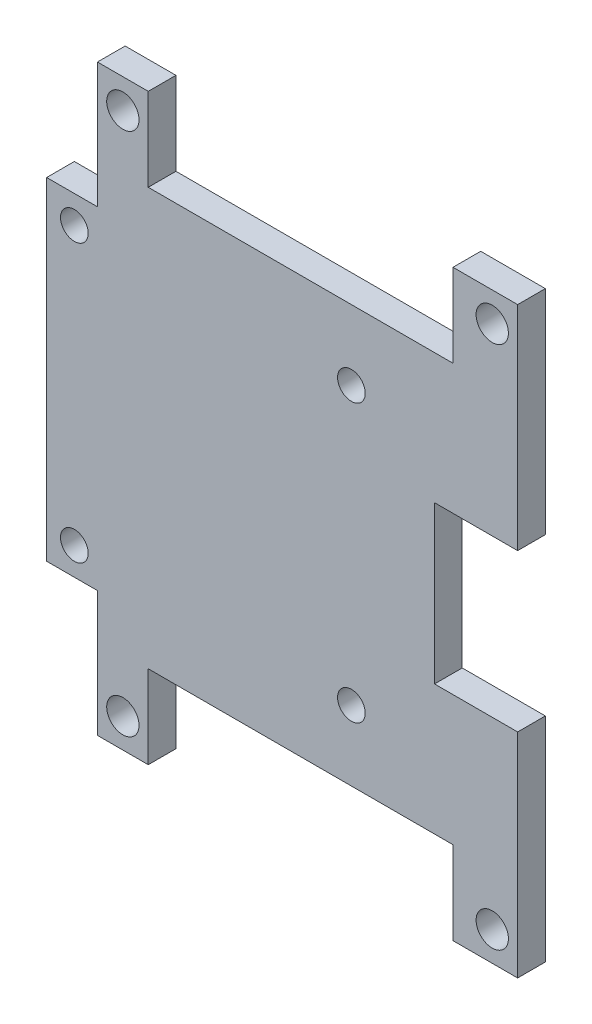
ISO-10303-21;
HEADER;
FILE_DESCRIPTION(('STEP AP214'),'2;1');
FILE_NAME('part.step','',(''),(''),'','','');
FILE_SCHEMA(('AUTOMOTIVE_DESIGN { 1 0 10303 214 1 1 1 1 }'));
ENDSEC;
DATA;
#1=APPLICATION_CONTEXT('core data for automotive mechanical design processes');
#2=APPLICATION_PROTOCOL_DEFINITION('international standard','automotive_design',2000,#1);
#3=PRODUCT_CONTEXT('',#1,'mechanical');
#4=PRODUCT('Part','Part','',(#3));
#5=PRODUCT_RELATED_PRODUCT_CATEGORY('part','',(#4));
#6=PRODUCT_DEFINITION_FORMATION('','',#4);
#7=PRODUCT_DEFINITION_CONTEXT('part definition',#1,'design');
#8=PRODUCT_DEFINITION('design','',#6,#7);
#9=PRODUCT_DEFINITION_SHAPE('','',#8);
#10=(LENGTH_UNIT() NAMED_UNIT(*) SI_UNIT(.MILLI.,.METRE.));
#11=(NAMED_UNIT(*) PLANE_ANGLE_UNIT() SI_UNIT($,.RADIAN.));
#12=(NAMED_UNIT(*) SI_UNIT($,.STERADIAN.) SOLID_ANGLE_UNIT());
#13=UNCERTAINTY_MEASURE_WITH_UNIT(LENGTH_MEASURE(1.E-05),#10,'distance_accuracy_value','');
#14=(GEOMETRIC_REPRESENTATION_CONTEXT(3) GLOBAL_UNCERTAINTY_ASSIGNED_CONTEXT((#13)) GLOBAL_UNIT_ASSIGNED_CONTEXT((#10,
#11,#12)) REPRESENTATION_CONTEXT('',''));
#15=CARTESIAN_POINT('',(0.,0.,0.));
#16=DIRECTION('',(0.,0.,1.));
#17=DIRECTION('',(1.,0.,0.));
#18=AXIS2_PLACEMENT_3D('',#15,#16,#17);
#19=CARTESIAN_POINT('',(22.75,-31.575,3.));
#20=DIRECTION('',(-1.,0.,0.));
#21=DIRECTION('',(0.,0.,1.));
#22=AXIS2_PLACEMENT_3D('',#19,#20,#21);
#23=PLANE('',#22);
#24=DIRECTION('',(0.,1.,0.));
#25=VECTOR('',#24,1.);
#26=CARTESIAN_POINT('',(22.75,-31.575,3.));
#27=LINE('',#26,#25);
#28=CARTESIAN_POINT('',(22.75,8.5,3.));
#29=VERTEX_POINT('',#28);
#30=CARTESIAN_POINT('',(22.75,31.575,3.));
#31=VERTEX_POINT('',#30);
#32=EDGE_CURVE('E339',#29,#31,#27,.T.);
#33=ORIENTED_EDGE('',*,*,#32,.F.);
#34=DIRECTION('',(0.,0.,-1.));
#35=VECTOR('',#34,1.);
#36=CARTESIAN_POINT('',(22.75,8.5,10.));
#37=LINE('',#36,#35);
#38=CARTESIAN_POINT('',(22.75,8.5,0.));
#39=VERTEX_POINT('',#38);
#40=EDGE_CURVE('E200',#29,#39,#37,.T.);
#41=ORIENTED_EDGE('',*,*,#40,.T.);
#42=DIRECTION('',(0.,1.,0.));
#43=VECTOR('',#42,1.);
#44=CARTESIAN_POINT('',(22.75,-31.575,0.));
#45=LINE('',#44,#43);
#46=CARTESIAN_POINT('',(22.75,31.575,0.));
#47=VERTEX_POINT('',#46);
#48=EDGE_CURVE('E332',#39,#47,#45,.T.);
#49=ORIENTED_EDGE('',*,*,#48,.T.);
#50=DIRECTION('',(0.,0.,-1.));
#51=VECTOR('',#50,1.);
#52=CARTESIAN_POINT('',(22.75,31.575,3.));
#53=LINE('',#52,#51);
#54=EDGE_CURVE('E11',#31,#47,#53,.T.);
#55=ORIENTED_EDGE('',*,*,#54,.F.);
#56=EDGE_LOOP('',(#33,#41,#49,#55));
#57=FACE_BOUND('',#56,.T.);
#58=ADVANCED_FACE('F38',(#57),#23,.F.);
#59=CARTESIAN_POINT('',(-22.75,-31.575,3.));
#60=DIRECTION('',(1.,0.,0.));
#61=DIRECTION('',(0.,0.,-1.));
#62=AXIS2_PLACEMENT_3D('',#59,#60,#61);
#63=PLANE('',#62);
#64=DIRECTION('',(0.,0.,1.));
#65=VECTOR('',#64,1.);
#66=CARTESIAN_POINT('',(-22.75,-17.995,0.));
#67=LINE('',#66,#65);
#68=CARTESIAN_POINT('',(-22.75,-17.995,0.));
#69=VERTEX_POINT('',#68);
#70=CARTESIAN_POINT('',(-22.75,-17.995,3.));
#71=VERTEX_POINT('',#70);
#72=EDGE_CURVE('E251',#69,#71,#67,.T.);
#73=ORIENTED_EDGE('',*,*,#72,.F.);
#74=DIRECTION('',(0.,-1.,0.));
#75=VECTOR('',#74,1.);
#76=CARTESIAN_POINT('',(-22.75,-31.575,0.));
#77=LINE('',#76,#75);
#78=CARTESIAN_POINT('',(-22.75,-31.575,0.));
#79=VERTEX_POINT('',#78);
#80=EDGE_CURVE('E358',#69,#79,#77,.T.);
#81=ORIENTED_EDGE('',*,*,#80,.T.);
#82=DIRECTION('',(0.,0.,-1.));
#83=VECTOR('',#82,1.);
#84=CARTESIAN_POINT('',(-22.75,-31.575,3.));
#85=LINE('',#84,#83);
#86=CARTESIAN_POINT('',(-22.75,-31.575,3.));
#87=VERTEX_POINT('',#86);
#88=EDGE_CURVE('E368',#87,#79,#85,.T.);
#89=ORIENTED_EDGE('',*,*,#88,.F.);
#90=DIRECTION('',(0.,-1.,0.));
#91=VECTOR('',#90,1.);
#92=CARTESIAN_POINT('',(-22.75,-31.575,3.));
#93=LINE('',#92,#91);
#94=EDGE_CURVE('E343',#71,#87,#93,.T.);
#95=ORIENTED_EDGE('',*,*,#94,.F.);
#96=EDGE_LOOP('',(#73,#81,#89,#95));
#97=FACE_BOUND('',#96,.T.);
#98=ADVANCED_FACE('F435',(#97),#63,.F.);
#99=CARTESIAN_POINT('',(-22.75,31.575,3.));
#100=DIRECTION('',(0.,-1.,0.));
#101=DIRECTION('',(0.,0.,-1.));
#102=AXIS2_PLACEMENT_3D('',#99,#100,#101);
#103=PLANE('',#102);
#104=DIRECTION('',(-1.,0.,0.));
#105=VECTOR('',#104,1.);
#106=CARTESIAN_POINT('',(-22.75,31.575,0.));
#107=LINE('',#106,#105);
#108=CARTESIAN_POINT('',(15.75,31.575,0.));
#109=VERTEX_POINT('',#108);
#110=EDGE_CURVE('E355',#47,#109,#107,.T.);
#111=ORIENTED_EDGE('',*,*,#110,.T.);
#112=DIRECTION('',(0.,0.,1.));
#113=VECTOR('',#112,1.);
#114=CARTESIAN_POINT('',(15.75,31.575,0.));
#115=LINE('',#114,#113);
#116=CARTESIAN_POINT('',(15.75,31.575,3.));
#117=VERTEX_POINT('',#116);
#118=EDGE_CURVE('E278',#109,#117,#115,.T.);
#119=ORIENTED_EDGE('',*,*,#118,.T.);
#120=DIRECTION('',(-1.,0.,0.));
#121=VECTOR('',#120,1.);
#122=CARTESIAN_POINT('',(-22.75,31.575,3.));
#123=LINE('',#122,#121);
#124=EDGE_CURVE('E340',#31,#117,#123,.T.);
#125=ORIENTED_EDGE('',*,*,#124,.F.);
#126=ORIENTED_EDGE('',*,*,#54,.T.);
#127=EDGE_LOOP('',(#111,#119,#125,#126));
#128=FACE_BOUND('',#127,.T.);
#129=ADVANCED_FACE('F402',(#128),#103,.F.);
#130=CARTESIAN_POINT('',(-22.75,-31.575,3.));
#131=DIRECTION('',(0.,1.,0.));
#132=DIRECTION('',(0.,0.,1.));
#133=AXIS2_PLACEMENT_3D('',#130,#131,#132);
#134=PLANE('',#133);
#135=DIRECTION('',(1.,0.,0.));
#136=VECTOR('',#135,1.);
#137=CARTESIAN_POINT('',(-22.75,-31.575,0.));
#138=LINE('',#137,#136);
#139=CARTESIAN_POINT('',(-17.25,-31.575,0.));
#140=VERTEX_POINT('',#139);
#141=EDGE_CURVE('E363',#79,#140,#138,.T.);
#142=ORIENTED_EDGE('',*,*,#141,.T.);
#143=DIRECTION('',(0.,0.,1.));
#144=VECTOR('',#143,1.);
#145=CARTESIAN_POINT('',(-17.25,-31.575,0.));
#146=LINE('',#145,#144);
#147=CARTESIAN_POINT('',(-17.25,-31.575,3.));
#148=VERTEX_POINT('',#147);
#149=EDGE_CURVE('E297',#140,#148,#146,.T.);
#150=ORIENTED_EDGE('',*,*,#149,.T.);
#151=DIRECTION('',(1.,0.,0.));
#152=VECTOR('',#151,1.);
#153=CARTESIAN_POINT('',(-22.75,-31.575,3.));
#154=LINE('',#153,#152);
#155=EDGE_CURVE('E348',#87,#148,#154,.T.);
#156=ORIENTED_EDGE('',*,*,#155,.F.);
#157=ORIENTED_EDGE('',*,*,#88,.T.);
#158=EDGE_LOOP('',(#142,#150,#156,#157));
#159=FACE_BOUND('',#158,.T.);
#160=ADVANCED_FACE('F429',(#159),#134,.F.);
#161=CARTESIAN_POINT('',(22.75,-31.575,0.));
#162=VERTEX_POINT('',#161);
#163=CARTESIAN_POINT('',(22.75,-8.5,0.));
#164=VERTEX_POINT('',#163);
#165=EDGE_CURVE('E352',#162,#164,#45,.T.);
#166=ORIENTED_EDGE('',*,*,#165,.T.);
#167=DIRECTION('',(0.,0.,-1.));
#168=VECTOR('',#167,1.);
#169=CARTESIAN_POINT('',(22.75,-8.5,10.));
#170=LINE('',#169,#168);
#171=CARTESIAN_POINT('',(22.75,-8.5,3.));
#172=VERTEX_POINT('',#171);
#173=EDGE_CURVE('E53',#172,#164,#170,.T.);
#174=ORIENTED_EDGE('',*,*,#173,.F.);
#175=CARTESIAN_POINT('',(22.75,-31.575,3.));
#176=VERTEX_POINT('',#175);
#177=EDGE_CURVE('E335',#176,#172,#27,.T.);
#178=ORIENTED_EDGE('',*,*,#177,.F.);
#179=DIRECTION('',(0.,0.,-1.));
#180=VECTOR('',#179,1.);
#181=CARTESIAN_POINT('',(22.75,-31.575,3.));
#182=LINE('',#181,#180);
#183=EDGE_CURVE('E351',#176,#162,#182,.T.);
#184=ORIENTED_EDGE('',*,*,#183,.T.);
#185=EDGE_LOOP('',(#166,#174,#178,#184));
#186=FACE_BOUND('',#185,.T.);
#187=ADVANCED_FACE('F40',(#186),#23,.F.);
#188=CARTESIAN_POINT('',(-17.25,31.575,3.));
#189=VERTEX_POINT('',#188);
#190=CARTESIAN_POINT('',(-22.75,31.575,3.));
#191=VERTEX_POINT('',#190);
#192=EDGE_CURVE('E338',#189,#191,#123,.T.);
#193=ORIENTED_EDGE('',*,*,#192,.F.);
#194=DIRECTION('',(0.,0.,1.));
#195=VECTOR('',#194,1.);
#196=CARTESIAN_POINT('',(-17.25,31.575,0.));
#197=LINE('',#196,#195);
#198=CARTESIAN_POINT('',(-17.25,31.575,0.));
#199=VERTEX_POINT('',#198);
#200=EDGE_CURVE('E269',#199,#189,#197,.T.);
#201=ORIENTED_EDGE('',*,*,#200,.F.);
#202=CARTESIAN_POINT('',(-22.75,31.575,0.));
#203=VERTEX_POINT('',#202);
#204=EDGE_CURVE('E354',#199,#203,#107,.T.);
#205=ORIENTED_EDGE('',*,*,#204,.T.);
#206=DIRECTION('',(0.,0.,-1.));
#207=VECTOR('',#206,1.);
#208=CARTESIAN_POINT('',(-22.75,31.575,3.));
#209=LINE('',#208,#207);
#210=EDGE_CURVE('E46',#191,#203,#209,.T.);
#211=ORIENTED_EDGE('',*,*,#210,.F.);
#212=EDGE_LOOP('',(#193,#201,#205,#211));
#213=FACE_BOUND('',#212,.T.);
#214=ADVANCED_FACE('F389',(#213),#103,.F.);
#215=CARTESIAN_POINT('',(-22.75,17.995,0.));
#216=VERTEX_POINT('',#215);
#217=EDGE_CURVE('E359',#203,#216,#77,.T.);
#218=ORIENTED_EDGE('',*,*,#217,.T.);
#219=DIRECTION('',(0.,0.,1.));
#220=VECTOR('',#219,1.);
#221=CARTESIAN_POINT('',(-22.75,17.995,0.));
#222=LINE('',#221,#220);
#223=CARTESIAN_POINT('',(-22.75,17.995,3.));
#224=VERTEX_POINT('',#223);
#225=EDGE_CURVE('E244',#216,#224,#222,.T.);
#226=ORIENTED_EDGE('',*,*,#225,.T.);
#227=EDGE_CURVE('E344',#191,#224,#93,.T.);
#228=ORIENTED_EDGE('',*,*,#227,.F.);
#229=ORIENTED_EDGE('',*,*,#210,.T.);
#230=EDGE_LOOP('',(#218,#226,#228,#229));
#231=FACE_BOUND('',#230,.T.);
#232=ADVANCED_FACE('F375',(#231),#63,.F.);
#233=CARTESIAN_POINT('',(15.75,-31.575,3.));
#234=VERTEX_POINT('',#233);
#235=EDGE_CURVE('E347',#234,#176,#154,.T.);
#236=ORIENTED_EDGE('',*,*,#235,.F.);
#237=DIRECTION('',(0.,0.,1.));
#238=VECTOR('',#237,1.);
#239=CARTESIAN_POINT('',(15.75,-31.575,0.));
#240=LINE('',#239,#238);
#241=CARTESIAN_POINT('',(15.75,-31.575,0.));
#242=VERTEX_POINT('',#241);
#243=EDGE_CURVE('E307',#242,#234,#240,.T.);
#244=ORIENTED_EDGE('',*,*,#243,.F.);
#245=EDGE_CURVE('E362',#242,#162,#138,.T.);
#246=ORIENTED_EDGE('',*,*,#245,.T.);
#247=ORIENTED_EDGE('',*,*,#183,.F.);
#248=EDGE_LOOP('',(#236,#244,#246,#247));
#249=FACE_BOUND('',#248,.T.);
#250=ADVANCED_FACE('F415',(#249),#134,.F.);
#251=CARTESIAN_POINT('',(0.,0.,3.));
#252=DIRECTION('',(0.,0.,-1.));
#253=DIRECTION('',(-1.,0.,0.));
#254=AXIS2_PLACEMENT_3D('',#251,#252,#253);
#255=PLANE('',#254);
#256=CARTESIAN_POINT('',(4.74999999999998,-15.,3.));
#257=DIRECTION('',(0.,0.,-1.));
#258=DIRECTION('',(-1.,0.,0.));
#259=AXIS2_PLACEMENT_3D('',#256,#257,#258);
#260=CIRCLE('',#259,1.5);
#261=CARTESIAN_POINT('',(3.24999999999998,-15.,3.));
#262=VERTEX_POINT('',#261);
#263=EDGE_CURVE('E225',#262,#262,#260,.T.);
#264=ORIENTED_EDGE('',*,*,#263,.T.);
#265=EDGE_LOOP('',(#264));
#266=FACE_BOUND('',#265,.T.);
#267=CARTESIAN_POINT('',(-25.25,-15.,3.));
#268=DIRECTION('',(0.,0.,-1.));
#269=DIRECTION('',(-1.,0.,0.));
#270=AXIS2_PLACEMENT_3D('',#267,#268,#269);
#271=CIRCLE('',#270,1.5);
#272=CARTESIAN_POINT('',(-26.75,-15.,3.));
#273=VERTEX_POINT('',#272);
#274=EDGE_CURVE('E219',#273,#273,#271,.T.);
#275=ORIENTED_EDGE('',*,*,#274,.T.);
#276=EDGE_LOOP('',(#275));
#277=FACE_BOUND('',#276,.T.);
#278=CARTESIAN_POINT('',(-25.25,15.,3.));
#279=DIRECTION('',(0.,0.,-1.));
#280=DIRECTION('',(-1.,0.,0.));
#281=AXIS2_PLACEMENT_3D('',#278,#279,#280);
#282=CIRCLE('',#281,1.5);
#283=CARTESIAN_POINT('',(-26.75,15.,3.));
#284=VERTEX_POINT('',#283);
#285=EDGE_CURVE('E212',#284,#284,#282,.T.);
#286=ORIENTED_EDGE('',*,*,#285,.T.);
#287=EDGE_LOOP('',(#286));
#288=FACE_BOUND('',#287,.T.);
#289=CARTESIAN_POINT('',(4.74999999999999,15.,3.));
#290=DIRECTION('',(0.,0.,-1.));
#291=DIRECTION('',(-1.,0.,0.));
#292=AXIS2_PLACEMENT_3D('',#289,#290,#291);
#293=CIRCLE('',#292,1.50000000000001);
#294=CARTESIAN_POINT('',(3.24999999999999,15.,3.));
#295=VERTEX_POINT('',#294);
#296=EDGE_CURVE('E230',#295,#295,#293,.T.);
#297=ORIENTED_EDGE('',*,*,#296,.T.);
#298=EDGE_LOOP('',(#297));
#299=FACE_BOUND('',#298,.T.);
#300=CARTESIAN_POINT('',(-20.,-28.395,3.));
#301=DIRECTION('',(0.,0.,1.));
#302=DIRECTION('',(-1.,0.,0.));
#303=AXIS2_PLACEMENT_3D('',#300,#301,#302);
#304=CIRCLE('',#303,1.75);
#305=CARTESIAN_POINT('',(-21.75,-28.395,3.));
#306=VERTEX_POINT('',#305);
#307=EDGE_CURVE('E281',#306,#306,#304,.T.);
#308=ORIENTED_EDGE('',*,*,#307,.F.);
#309=EDGE_LOOP('',(#308));
#310=FACE_BOUND('',#309,.T.);
#311=CARTESIAN_POINT('',(-20.,28.395,3.));
#312=DIRECTION('',(0.,0.,1.));
#313=DIRECTION('',(1.,0.,0.));
#314=AXIS2_PLACEMENT_3D('',#311,#312,#313);
#315=CIRCLE('',#314,1.75);
#316=CARTESIAN_POINT('',(-18.25,28.395,3.));
#317=VERTEX_POINT('',#316);
#318=EDGE_CURVE('E321',#317,#317,#315,.T.);
#319=ORIENTED_EDGE('',*,*,#318,.F.);
#320=EDGE_LOOP('',(#319));
#321=FACE_BOUND('',#320,.T.);
#322=CARTESIAN_POINT('',(20.,28.395,3.));
#323=DIRECTION('',(0.,0.,1.));
#324=DIRECTION('',(-1.,0.,0.));
#325=AXIS2_PLACEMENT_3D('',#322,#323,#324);
#326=CIRCLE('',#325,1.75);
#327=CARTESIAN_POINT('',(18.25,28.395,3.));
#328=VERTEX_POINT('',#327);
#329=EDGE_CURVE('E315',#328,#328,#326,.T.);
#330=ORIENTED_EDGE('',*,*,#329,.F.);
#331=EDGE_LOOP('',(#330));
#332=FACE_BOUND('',#331,.T.);
#333=CARTESIAN_POINT('',(20.,-28.395,3.));
#334=DIRECTION('',(0.,0.,1.));
#335=DIRECTION('',(1.,0.,0.));
#336=AXIS2_PLACEMENT_3D('',#333,#334,#335);
#337=CIRCLE('',#336,1.75);
#338=CARTESIAN_POINT('',(21.75,-28.395,3.));
#339=VERTEX_POINT('',#338);
#340=EDGE_CURVE('E314',#339,#339,#337,.T.);
#341=ORIENTED_EDGE('',*,*,#340,.F.);
#342=EDGE_LOOP('',(#341));
#343=FACE_BOUND('',#342,.T.);
#344=DIRECTION('',(0.,1.,0.));
#345=VECTOR('',#344,1.);
#346=CARTESIAN_POINT('',(13.75,0.,3.));
#347=LINE('',#346,#345);
#348=CARTESIAN_POINT('',(13.75,-8.5,3.));
#349=VERTEX_POINT('',#348);
#350=CARTESIAN_POINT('',(13.75,8.5,3.));
#351=VERTEX_POINT('',#350);
#352=EDGE_CURVE('E183',#349,#351,#347,.T.);
#353=ORIENTED_EDGE('',*,*,#352,.T.);
#354=DIRECTION('',(1.,0.,0.));
#355=VECTOR('',#354,1.);
#356=CARTESIAN_POINT('',(0.,8.5,3.));
#357=LINE('',#356,#355);
#358=EDGE_CURVE('E208',#351,#29,#357,.T.);
#359=ORIENTED_EDGE('',*,*,#358,.T.);
#360=ORIENTED_EDGE('',*,*,#32,.T.);
#361=ORIENTED_EDGE('',*,*,#124,.T.);
#362=DIRECTION('',(0.,1.,0.));
#363=VECTOR('',#362,1.);
#364=CARTESIAN_POINT('',(15.75,31.575,3.));
#365=LINE('',#364,#363);
#366=CARTESIAN_POINT('',(15.75,22.575,3.));
#367=VERTEX_POINT('',#366);
#368=EDGE_CURVE('E263',#367,#117,#365,.T.);
#369=ORIENTED_EDGE('',*,*,#368,.F.);
#370=DIRECTION('',(1.,0.,0.));
#371=VECTOR('',#370,1.);
#372=CARTESIAN_POINT('',(15.75,22.575,3.));
#373=LINE('',#372,#371);
#374=CARTESIAN_POINT('',(-17.25,22.5750000000001,3.));
#375=VERTEX_POINT('',#374);
#376=EDGE_CURVE('E273',#375,#367,#373,.T.);
#377=ORIENTED_EDGE('',*,*,#376,.F.);
#378=DIRECTION('',(0.,-1.,0.));
#379=VECTOR('',#378,1.);
#380=CARTESIAN_POINT('',(-17.25,22.5750000000001,3.));
#381=LINE('',#380,#379);
#382=EDGE_CURVE('E270',#189,#375,#381,.T.);
#383=ORIENTED_EDGE('',*,*,#382,.F.);
#384=ORIENTED_EDGE('',*,*,#192,.T.);
#385=ORIENTED_EDGE('',*,*,#227,.T.);
#386=DIRECTION('',(-1.,0.,0.));
#387=VECTOR('',#386,1.);
#388=CARTESIAN_POINT('',(-28.25,17.995,3.));
#389=LINE('',#388,#387);
#390=CARTESIAN_POINT('',(-28.25,17.995,3.));
#391=VERTEX_POINT('',#390);
#392=EDGE_CURVE('E61',#224,#391,#389,.T.);
#393=ORIENTED_EDGE('',*,*,#392,.T.);
#394=DIRECTION('',(0.,-1.,0.));
#395=VECTOR('',#394,1.);
#396=CARTESIAN_POINT('',(-28.25,-17.995,3.));
#397=LINE('',#396,#395);
#398=CARTESIAN_POINT('',(-28.25,-17.995,3.));
#399=VERTEX_POINT('',#398);
#400=EDGE_CURVE('E246',#391,#399,#397,.T.);
#401=ORIENTED_EDGE('',*,*,#400,.T.);
#402=DIRECTION('',(1.,0.,0.));
#403=VECTOR('',#402,1.);
#404=CARTESIAN_POINT('',(-22.75,-17.995,3.));
#405=LINE('',#404,#403);
#406=EDGE_CURVE('E239',#399,#71,#405,.T.);
#407=ORIENTED_EDGE('',*,*,#406,.T.);
#408=ORIENTED_EDGE('',*,*,#94,.T.);
#409=ORIENTED_EDGE('',*,*,#155,.T.);
#410=DIRECTION('',(0.,-1.,0.));
#411=VECTOR('',#410,1.);
#412=CARTESIAN_POINT('',(-17.25,-22.5750000000001,3.));
#413=LINE('',#412,#411);
#414=CARTESIAN_POINT('',(-17.25,-22.5750000000001,3.));
#415=VERTEX_POINT('',#414);
#416=EDGE_CURVE('E253',#415,#148,#413,.T.);
#417=ORIENTED_EDGE('',*,*,#416,.F.);
#418=DIRECTION('',(-1.,0.,0.));
#419=VECTOR('',#418,1.);
#420=CARTESIAN_POINT('',(15.75,-22.575,3.));
#421=LINE('',#420,#419);
#422=CARTESIAN_POINT('',(15.75,-22.575,3.));
#423=VERTEX_POINT('',#422);
#424=EDGE_CURVE('E291',#423,#415,#421,.T.);
#425=ORIENTED_EDGE('',*,*,#424,.F.);
#426=DIRECTION('',(0.,1.,0.));
#427=VECTOR('',#426,1.);
#428=CARTESIAN_POINT('',(15.75,-31.575,3.));
#429=LINE('',#428,#427);
#430=EDGE_CURVE('E299',#234,#423,#429,.T.);
#431=ORIENTED_EDGE('',*,*,#430,.F.);
#432=ORIENTED_EDGE('',*,*,#235,.T.);
#433=ORIENTED_EDGE('',*,*,#177,.T.);
#434=DIRECTION('',(-1.,0.,0.));
#435=VECTOR('',#434,1.);
#436=CARTESIAN_POINT('',(0.,-8.5,3.));
#437=LINE('',#436,#435);
#438=EDGE_CURVE('E203',#172,#349,#437,.T.);
#439=ORIENTED_EDGE('',*,*,#438,.T.);
#440=EDGE_LOOP('',(#353,#359,#360,#361,#369,#377,#383,#384,#385,#393,#401,#407,#408,#409,#417,
#425,#431,#432,#433,#439));
#441=FACE_BOUND('',#440,.T.);
#442=ADVANCED_FACE('F385',(#266,#277,#288,#299,#310,#321,#332,#343,#441),#255,.F.);
#443=CARTESIAN_POINT('',(0.,0.,0.));
#444=DIRECTION('',(0.,0.,-1.));
#445=DIRECTION('',(-1.,0.,0.));
#446=AXIS2_PLACEMENT_3D('',#443,#444,#445);
#447=PLANE('',#446);
#448=DIRECTION('',(1.,0.,0.));
#449=VECTOR('',#448,1.);
#450=CARTESIAN_POINT('',(13.75,8.5,0.));
#451=LINE('',#450,#449);
#452=CARTESIAN_POINT('',(13.75,8.5,0.));
#453=VERTEX_POINT('',#452);
#454=EDGE_CURVE('E196',#453,#39,#451,.T.);
#455=ORIENTED_EDGE('',*,*,#454,.F.);
#456=DIRECTION('',(0.,1.,0.));
#457=VECTOR('',#456,1.);
#458=CARTESIAN_POINT('',(13.75,-8.5,0.));
#459=LINE('',#458,#457);
#460=CARTESIAN_POINT('',(13.75,-8.5,0.));
#461=VERTEX_POINT('',#460);
#462=EDGE_CURVE('E180',#461,#453,#459,.T.);
#463=ORIENTED_EDGE('',*,*,#462,.F.);
#464=DIRECTION('',(-1.,0.,0.));
#465=VECTOR('',#464,1.);
#466=CARTESIAN_POINT('',(22.75,-8.5,0.));
#467=LINE('',#466,#465);
#468=EDGE_CURVE('E187',#164,#461,#467,.T.);
#469=ORIENTED_EDGE('',*,*,#468,.F.);
#470=ORIENTED_EDGE('',*,*,#165,.F.);
#471=ORIENTED_EDGE('',*,*,#245,.F.);
#472=DIRECTION('',(0.,1.,0.));
#473=VECTOR('',#472,1.);
#474=CARTESIAN_POINT('',(15.75,-31.575,0.));
#475=LINE('',#474,#473);
#476=CARTESIAN_POINT('',(15.75,-22.575,0.));
#477=VERTEX_POINT('',#476);
#478=EDGE_CURVE('E290',#242,#477,#475,.T.);
#479=ORIENTED_EDGE('',*,*,#478,.T.);
#480=DIRECTION('',(-1.,0.,0.));
#481=VECTOR('',#480,1.);
#482=CARTESIAN_POINT('',(15.75,-22.575,0.));
#483=LINE('',#482,#481);
#484=CARTESIAN_POINT('',(-17.25,-22.5750000000001,0.));
#485=VERTEX_POINT('',#484);
#486=EDGE_CURVE('E294',#477,#485,#483,.T.);
#487=ORIENTED_EDGE('',*,*,#486,.T.);
#488=DIRECTION('',(0.,-1.,0.));
#489=VECTOR('',#488,1.);
#490=CARTESIAN_POINT('',(-17.25,-22.5750000000001,0.));
#491=LINE('',#490,#489);
#492=EDGE_CURVE('E287',#485,#140,#491,.T.);
#493=ORIENTED_EDGE('',*,*,#492,.T.);
#494=ORIENTED_EDGE('',*,*,#141,.F.);
#495=ORIENTED_EDGE('',*,*,#80,.F.);
#496=DIRECTION('',(1.,0.,0.));
#497=VECTOR('',#496,1.);
#498=CARTESIAN_POINT('',(-22.75,-17.995,0.));
#499=LINE('',#498,#497);
#500=CARTESIAN_POINT('',(-28.25,-17.995,0.));
#501=VERTEX_POINT('',#500);
#502=EDGE_CURVE('E242',#501,#69,#499,.T.);
#503=ORIENTED_EDGE('',*,*,#502,.F.);
#504=DIRECTION('',(0.,-1.,0.));
#505=VECTOR('',#504,1.);
#506=CARTESIAN_POINT('',(-28.25,-17.995,0.));
#507=LINE('',#506,#505);
#508=CARTESIAN_POINT('',(-28.25,17.995,0.));
#509=VERTEX_POINT('',#508);
#510=EDGE_CURVE('E238',#509,#501,#507,.T.);
#511=ORIENTED_EDGE('',*,*,#510,.F.);
#512=DIRECTION('',(-1.,0.,0.));
#513=VECTOR('',#512,1.);
#514=CARTESIAN_POINT('',(-28.25,17.995,0.));
#515=LINE('',#514,#513);
#516=EDGE_CURVE('E235',#216,#509,#515,.T.);
#517=ORIENTED_EDGE('',*,*,#516,.F.);
#518=ORIENTED_EDGE('',*,*,#217,.F.);
#519=ORIENTED_EDGE('',*,*,#204,.F.);
#520=DIRECTION('',(0.,-1.,0.));
#521=VECTOR('',#520,1.);
#522=CARTESIAN_POINT('',(-17.25,22.5750000000001,0.));
#523=LINE('',#522,#521);
#524=CARTESIAN_POINT('',(-17.25,22.5750000000001,0.));
#525=VERTEX_POINT('',#524);
#526=EDGE_CURVE('E259',#199,#525,#523,.T.);
#527=ORIENTED_EDGE('',*,*,#526,.T.);
#528=DIRECTION('',(1.,0.,0.));
#529=VECTOR('',#528,1.);
#530=CARTESIAN_POINT('',(15.75,22.575,0.));
#531=LINE('',#530,#529);
#532=CARTESIAN_POINT('',(15.75,22.575,0.));
#533=VERTEX_POINT('',#532);
#534=EDGE_CURVE('E262',#525,#533,#531,.T.);
#535=ORIENTED_EDGE('',*,*,#534,.T.);
#536=DIRECTION('',(0.,1.,0.));
#537=VECTOR('',#536,1.);
#538=CARTESIAN_POINT('',(15.75,31.575,0.));
#539=LINE('',#538,#537);
#540=EDGE_CURVE('E266',#533,#109,#539,.T.);
#541=ORIENTED_EDGE('',*,*,#540,.T.);
#542=ORIENTED_EDGE('',*,*,#110,.F.);
#543=ORIENTED_EDGE('',*,*,#48,.F.);
#544=EDGE_LOOP('',(#455,#463,#469,#470,#471,#479,#487,#493,#494,#495,#503,#511,#517,#518,#519,
#527,#535,#541,#542,#543));
#545=FACE_BOUND('',#544,.T.);
#546=CARTESIAN_POINT('',(4.74999999999998,-15.,0.));
#547=DIRECTION('',(0.,0.,-1.));
#548=DIRECTION('',(-1.,0.,0.));
#549=AXIS2_PLACEMENT_3D('',#546,#547,#548);
#550=CIRCLE('',#549,1.5);
#551=CARTESIAN_POINT('',(3.24999999999998,-15.,0.));
#552=VERTEX_POINT('',#551);
#553=EDGE_CURVE('E211',#552,#552,#550,.T.);
#554=ORIENTED_EDGE('',*,*,#553,.F.);
#555=EDGE_LOOP('',(#554));
#556=FACE_BOUND('',#555,.T.);
#557=CARTESIAN_POINT('',(-25.25,-15.,0.));
#558=DIRECTION('',(0.,0.,-1.));
#559=DIRECTION('',(-1.,0.,0.));
#560=AXIS2_PLACEMENT_3D('',#557,#558,#559);
#561=CIRCLE('',#560,1.5);
#562=CARTESIAN_POINT('',(-26.75,-15.,0.));
#563=VERTEX_POINT('',#562);
#564=EDGE_CURVE('E222',#563,#563,#561,.T.);
#565=ORIENTED_EDGE('',*,*,#564,.F.);
#566=EDGE_LOOP('',(#565));
#567=FACE_BOUND('',#566,.T.);
#568=CARTESIAN_POINT('',(-25.25,15.,0.));
#569=DIRECTION('',(0.,0.,-1.));
#570=DIRECTION('',(-1.,0.,0.));
#571=AXIS2_PLACEMENT_3D('',#568,#569,#570);
#572=CIRCLE('',#571,1.5);
#573=CARTESIAN_POINT('',(-26.75,15.,0.));
#574=VERTEX_POINT('',#573);
#575=EDGE_CURVE('E216',#574,#574,#572,.T.);
#576=ORIENTED_EDGE('',*,*,#575,.F.);
#577=EDGE_LOOP('',(#576));
#578=FACE_BOUND('',#577,.T.);
#579=CARTESIAN_POINT('',(4.74999999999999,15.,0.));
#580=DIRECTION('',(0.,0.,-1.));
#581=DIRECTION('',(-1.,0.,0.));
#582=AXIS2_PLACEMENT_3D('',#579,#580,#581);
#583=CIRCLE('',#582,1.50000000000001);
#584=CARTESIAN_POINT('',(3.24999999999999,15.,0.));
#585=VERTEX_POINT('',#584);
#586=EDGE_CURVE('E215',#585,#585,#583,.T.);
#587=ORIENTED_EDGE('',*,*,#586,.F.);
#588=EDGE_LOOP('',(#587));
#589=FACE_BOUND('',#588,.T.);
#590=CARTESIAN_POINT('',(-20.,-28.395,0.));
#591=DIRECTION('',(0.,0.,1.));
#592=DIRECTION('',(-1.,0.,0.));
#593=AXIS2_PLACEMENT_3D('',#590,#591,#592);
#594=CIRCLE('',#593,1.75);
#595=CARTESIAN_POINT('',(-21.75,-28.395,0.));
#596=VERTEX_POINT('',#595);
#597=EDGE_CURVE('E324',#596,#596,#594,.T.);
#598=ORIENTED_EDGE('',*,*,#597,.T.);
#599=EDGE_LOOP('',(#598));
#600=FACE_BOUND('',#599,.T.);
#601=CARTESIAN_POINT('',(-20.,28.395,0.));
#602=DIRECTION('',(0.,0.,1.));
#603=DIRECTION('',(1.,0.,0.));
#604=AXIS2_PLACEMENT_3D('',#601,#602,#603);
#605=CIRCLE('',#604,1.75);
#606=CARTESIAN_POINT('',(-18.25,28.395,0.));
#607=VERTEX_POINT('',#606);
#608=EDGE_CURVE('E318',#607,#607,#605,.T.);
#609=ORIENTED_EDGE('',*,*,#608,.T.);
#610=EDGE_LOOP('',(#609));
#611=FACE_BOUND('',#610,.T.);
#612=CARTESIAN_POINT('',(20.,28.395,0.));
#613=DIRECTION('',(0.,0.,1.));
#614=DIRECTION('',(-1.,0.,0.));
#615=AXIS2_PLACEMENT_3D('',#612,#613,#614);
#616=CIRCLE('',#615,1.75);
#617=CARTESIAN_POINT('',(18.25,28.395,0.));
#618=VERTEX_POINT('',#617);
#619=EDGE_CURVE('E311',#618,#618,#616,.T.);
#620=ORIENTED_EDGE('',*,*,#619,.T.);
#621=EDGE_LOOP('',(#620));
#622=FACE_BOUND('',#621,.T.);
#623=CARTESIAN_POINT('',(20.,-28.395,0.));
#624=DIRECTION('',(0.,0.,1.));
#625=DIRECTION('',(1.,0.,0.));
#626=AXIS2_PLACEMENT_3D('',#623,#624,#625);
#627=CIRCLE('',#626,1.75);
#628=CARTESIAN_POINT('',(21.75,-28.395,0.));
#629=VERTEX_POINT('',#628);
#630=EDGE_CURVE('E329',#629,#629,#627,.T.);
#631=ORIENTED_EDGE('',*,*,#630,.T.);
#632=EDGE_LOOP('',(#631));
#633=FACE_BOUND('',#632,.T.);
#634=ADVANCED_FACE('F193',(#545,#556,#567,#578,#589,#600,#611,#622,#633),#447,.T.);
#635=CARTESIAN_POINT('',(20.,-28.395,0.));
#636=DIRECTION('',(0.,0.,1.));
#637=DIRECTION('',(1.,0.,0.));
#638=AXIS2_PLACEMENT_3D('',#635,#636,#637);
#639=CYLINDRICAL_SURFACE('',#638,1.75);
#640=ORIENTED_EDGE('',*,*,#630,.F.);
#641=EDGE_LOOP('',(#640));
#642=FACE_BOUND('',#641,.T.);
#643=ORIENTED_EDGE('',*,*,#340,.T.);
#644=EDGE_LOOP('',(#643));
#645=FACE_BOUND('',#644,.T.);
#646=ADVANCED_FACE('F579',(#642,#645),#639,.F.);
#647=CARTESIAN_POINT('',(20.,28.395,0.));
#648=DIRECTION('',(0.,0.,1.));
#649=DIRECTION('',(1.,0.,0.));
#650=AXIS2_PLACEMENT_3D('',#647,#648,#649);
#651=CYLINDRICAL_SURFACE('',#650,1.75);
#652=ORIENTED_EDGE('',*,*,#619,.F.);
#653=EDGE_LOOP('',(#652));
#654=FACE_BOUND('',#653,.T.);
#655=ORIENTED_EDGE('',*,*,#329,.T.);
#656=EDGE_LOOP('',(#655));
#657=FACE_BOUND('',#656,.T.);
#658=ADVANCED_FACE('F569',(#654,#657),#651,.F.);
#659=CARTESIAN_POINT('',(-20.,28.395,0.));
#660=DIRECTION('',(0.,0.,1.));
#661=DIRECTION('',(1.,0.,0.));
#662=AXIS2_PLACEMENT_3D('',#659,#660,#661);
#663=CYLINDRICAL_SURFACE('',#662,1.75);
#664=ORIENTED_EDGE('',*,*,#608,.F.);
#665=EDGE_LOOP('',(#664));
#666=FACE_BOUND('',#665,.T.);
#667=ORIENTED_EDGE('',*,*,#318,.T.);
#668=EDGE_LOOP('',(#667));
#669=FACE_BOUND('',#668,.T.);
#670=ADVANCED_FACE('F559',(#666,#669),#663,.F.);
#671=CARTESIAN_POINT('',(-20.,-28.395,0.));
#672=DIRECTION('',(0.,0.,1.));
#673=DIRECTION('',(1.,0.,0.));
#674=AXIS2_PLACEMENT_3D('',#671,#672,#673);
#675=CYLINDRICAL_SURFACE('',#674,1.75);
#676=ORIENTED_EDGE('',*,*,#597,.F.);
#677=EDGE_LOOP('',(#676));
#678=FACE_BOUND('',#677,.T.);
#679=ORIENTED_EDGE('',*,*,#307,.T.);
#680=EDGE_LOOP('',(#679));
#681=FACE_BOUND('',#680,.T.);
#682=ADVANCED_FACE('F499',(#678,#681),#675,.F.);
#683=CARTESIAN_POINT('',(-17.25,-22.5750000000001,0.));
#684=DIRECTION('',(-1.,0.,0.));
#685=DIRECTION('',(0.,-1.,0.));
#686=AXIS2_PLACEMENT_3D('',#683,#684,#685);
#687=PLANE('',#686);
#688=ORIENTED_EDGE('',*,*,#416,.T.);
#689=ORIENTED_EDGE('',*,*,#149,.F.);
#690=ORIENTED_EDGE('',*,*,#492,.F.);
#691=DIRECTION('',(0.,0.,1.));
#692=VECTOR('',#691,1.);
#693=CARTESIAN_POINT('',(-17.25,-22.5750000000001,0.));
#694=LINE('',#693,#692);
#695=EDGE_CURVE('E274',#485,#415,#694,.T.);
#696=ORIENTED_EDGE('',*,*,#695,.T.);
#697=EDGE_LOOP('',(#688,#689,#690,#696));
#698=FACE_BOUND('',#697,.T.);
#699=ADVANCED_FACE('F494',(#698),#687,.F.);
#700=CARTESIAN_POINT('',(15.75,-22.575,0.));
#701=DIRECTION('',(0.,1.,0.));
#702=DIRECTION('',(-1.,0.,0.));
#703=AXIS2_PLACEMENT_3D('',#700,#701,#702);
#704=PLANE('',#703);
#705=ORIENTED_EDGE('',*,*,#424,.T.);
#706=ORIENTED_EDGE('',*,*,#695,.F.);
#707=ORIENTED_EDGE('',*,*,#486,.F.);
#708=DIRECTION('',(0.,0.,1.));
#709=VECTOR('',#708,1.);
#710=CARTESIAN_POINT('',(15.75,-22.575,0.));
#711=LINE('',#710,#709);
#712=EDGE_CURVE('E305',#477,#423,#711,.T.);
#713=ORIENTED_EDGE('',*,*,#712,.T.);
#714=EDGE_LOOP('',(#705,#706,#707,#713));
#715=FACE_BOUND('',#714,.T.);
#716=ADVANCED_FACE('F423',(#715),#704,.F.);
#717=CARTESIAN_POINT('',(15.75,-31.575,0.));
#718=DIRECTION('',(1.,0.,0.));
#719=DIRECTION('',(0.,0.,-1.));
#720=AXIS2_PLACEMENT_3D('',#717,#718,#719);
#721=PLANE('',#720);
#722=ORIENTED_EDGE('',*,*,#430,.T.);
#723=ORIENTED_EDGE('',*,*,#712,.F.);
#724=ORIENTED_EDGE('',*,*,#478,.F.);
#725=ORIENTED_EDGE('',*,*,#243,.T.);
#726=EDGE_LOOP('',(#722,#723,#724,#725));
#727=FACE_BOUND('',#726,.T.);
#728=ADVANCED_FACE('F418',(#727),#721,.F.);
#729=CARTESIAN_POINT('',(15.75,31.575,0.));
#730=DIRECTION('',(1.,0.,0.));
#731=DIRECTION('',(0.,0.,-1.));
#732=AXIS2_PLACEMENT_3D('',#729,#730,#731);
#733=PLANE('',#732);
#734=ORIENTED_EDGE('',*,*,#368,.T.);
#735=ORIENTED_EDGE('',*,*,#118,.F.);
#736=ORIENTED_EDGE('',*,*,#540,.F.);
#737=DIRECTION('',(0.,0.,1.));
#738=VECTOR('',#737,1.);
#739=CARTESIAN_POINT('',(15.75,22.575,0.));
#740=LINE('',#739,#738);
#741=EDGE_CURVE('E282',#533,#367,#740,.T.);
#742=ORIENTED_EDGE('',*,*,#741,.T.);
#743=EDGE_LOOP('',(#734,#735,#736,#742));
#744=FACE_BOUND('',#743,.T.);
#745=ADVANCED_FACE('F399',(#744),#733,.F.);
#746=CARTESIAN_POINT('',(15.75,22.575,0.));
#747=DIRECTION('',(0.,-1.,0.));
#748=DIRECTION('',(1.,0.,0.));
#749=AXIS2_PLACEMENT_3D('',#746,#747,#748);
#750=PLANE('',#749);
#751=ORIENTED_EDGE('',*,*,#376,.T.);
#752=ORIENTED_EDGE('',*,*,#741,.F.);
#753=ORIENTED_EDGE('',*,*,#534,.F.);
#754=DIRECTION('',(0.,0.,1.));
#755=VECTOR('',#754,1.);
#756=CARTESIAN_POINT('',(-17.25,22.5750000000001,0.));
#757=LINE('',#756,#755);
#758=EDGE_CURVE('E284',#525,#375,#757,.T.);
#759=ORIENTED_EDGE('',*,*,#758,.T.);
#760=EDGE_LOOP('',(#751,#752,#753,#759));
#761=FACE_BOUND('',#760,.T.);
#762=ADVANCED_FACE('F396',(#761),#750,.F.);
#763=CARTESIAN_POINT('',(-17.25,22.5750000000001,0.));
#764=DIRECTION('',(-1.,0.,0.));
#765=DIRECTION('',(0.,-1.,0.));
#766=AXIS2_PLACEMENT_3D('',#763,#764,#765);
#767=PLANE('',#766);
#768=ORIENTED_EDGE('',*,*,#382,.T.);
#769=ORIENTED_EDGE('',*,*,#758,.F.);
#770=ORIENTED_EDGE('',*,*,#526,.F.);
#771=ORIENTED_EDGE('',*,*,#200,.T.);
#772=EDGE_LOOP('',(#768,#769,#770,#771));
#773=FACE_BOUND('',#772,.T.);
#774=ADVANCED_FACE('F391',(#773),#767,.F.);
#775=CARTESIAN_POINT('',(-22.75,-17.995,0.));
#776=DIRECTION('',(0.,-1.,0.));
#777=DIRECTION('',(0.,0.,-1.));
#778=AXIS2_PLACEMENT_3D('',#775,#776,#777);
#779=PLANE('',#778);
#780=ORIENTED_EDGE('',*,*,#406,.F.);
#781=DIRECTION('',(0.,0.,1.));
#782=VECTOR('',#781,1.);
#783=CARTESIAN_POINT('',(-28.25,-17.995,0.));
#784=LINE('',#783,#782);
#785=EDGE_CURVE('E254',#501,#399,#784,.T.);
#786=ORIENTED_EDGE('',*,*,#785,.F.);
#787=ORIENTED_EDGE('',*,*,#502,.T.);
#788=ORIENTED_EDGE('',*,*,#72,.T.);
#789=EDGE_LOOP('',(#780,#786,#787,#788));
#790=FACE_BOUND('',#789,.T.);
#791=ADVANCED_FACE('F438',(#790),#779,.T.);
#792=CARTESIAN_POINT('',(-28.25,-17.995,0.));
#793=DIRECTION('',(-1.,0.,0.));
#794=DIRECTION('',(0.,0.,1.));
#795=AXIS2_PLACEMENT_3D('',#792,#793,#794);
#796=PLANE('',#795);
#797=ORIENTED_EDGE('',*,*,#400,.F.);
#798=DIRECTION('',(0.,0.,1.));
#799=VECTOR('',#798,1.);
#800=CARTESIAN_POINT('',(-28.25,17.995,0.));
#801=LINE('',#800,#799);
#802=EDGE_CURVE('E256',#509,#391,#801,.T.);
#803=ORIENTED_EDGE('',*,*,#802,.F.);
#804=ORIENTED_EDGE('',*,*,#510,.T.);
#805=ORIENTED_EDGE('',*,*,#785,.T.);
#806=EDGE_LOOP('',(#797,#803,#804,#805));
#807=FACE_BOUND('',#806,.T.);
#808=ADVANCED_FACE('F440',(#807),#796,.T.);
#809=CARTESIAN_POINT('',(-28.25,17.995,0.));
#810=DIRECTION('',(0.,1.,0.));
#811=DIRECTION('',(0.,0.,1.));
#812=AXIS2_PLACEMENT_3D('',#809,#810,#811);
#813=PLANE('',#812);
#814=ORIENTED_EDGE('',*,*,#392,.F.);
#815=ORIENTED_EDGE('',*,*,#225,.F.);
#816=ORIENTED_EDGE('',*,*,#516,.T.);
#817=ORIENTED_EDGE('',*,*,#802,.T.);
#818=EDGE_LOOP('',(#814,#815,#816,#817));
#819=FACE_BOUND('',#818,.T.);
#820=ADVANCED_FACE('F382',(#819),#813,.T.);
#821=CARTESIAN_POINT('',(4.74999999999999,15.,3.));
#822=DIRECTION('',(0.,0.,-1.));
#823=DIRECTION('',(-1.,0.,0.));
#824=AXIS2_PLACEMENT_3D('',#821,#822,#823);
#825=CYLINDRICAL_SURFACE('',#824,1.50000000000001);
#826=ORIENTED_EDGE('',*,*,#296,.F.);
#827=EDGE_LOOP('',(#826));
#828=FACE_BOUND('',#827,.T.);
#829=ORIENTED_EDGE('',*,*,#586,.T.);
#830=EDGE_LOOP('',(#829));
#831=FACE_BOUND('',#830,.T.);
#832=ADVANCED_FACE('F447',(#828,#831),#825,.F.);
#833=CARTESIAN_POINT('',(-25.25,15.,3.));
#834=DIRECTION('',(0.,0.,-1.));
#835=DIRECTION('',(-1.,0.,0.));
#836=AXIS2_PLACEMENT_3D('',#833,#834,#835);
#837=CYLINDRICAL_SURFACE('',#836,1.5);
#838=ORIENTED_EDGE('',*,*,#285,.F.);
#839=EDGE_LOOP('',(#838));
#840=FACE_BOUND('',#839,.T.);
#841=ORIENTED_EDGE('',*,*,#575,.T.);
#842=EDGE_LOOP('',(#841));
#843=FACE_BOUND('',#842,.T.);
#844=ADVANCED_FACE('F630',(#840,#843),#837,.F.);
#845=CARTESIAN_POINT('',(-25.25,-15.,3.));
#846=DIRECTION('',(0.,0.,-1.));
#847=DIRECTION('',(-1.,0.,0.));
#848=AXIS2_PLACEMENT_3D('',#845,#846,#847);
#849=CYLINDRICAL_SURFACE('',#848,1.5);
#850=ORIENTED_EDGE('',*,*,#274,.F.);
#851=EDGE_LOOP('',(#850));
#852=FACE_BOUND('',#851,.T.);
#853=ORIENTED_EDGE('',*,*,#564,.T.);
#854=EDGE_LOOP('',(#853));
#855=FACE_BOUND('',#854,.T.);
#856=ADVANCED_FACE('F619',(#852,#855),#849,.F.);
#857=CARTESIAN_POINT('',(4.74999999999998,-15.,3.));
#858=DIRECTION('',(0.,0.,-1.));
#859=DIRECTION('',(-1.,0.,0.));
#860=AXIS2_PLACEMENT_3D('',#857,#858,#859);
#861=CYLINDRICAL_SURFACE('',#860,1.5);
#862=ORIENTED_EDGE('',*,*,#263,.F.);
#863=EDGE_LOOP('',(#862));
#864=FACE_BOUND('',#863,.T.);
#865=ORIENTED_EDGE('',*,*,#553,.T.);
#866=EDGE_LOOP('',(#865));
#867=FACE_BOUND('',#866,.T.);
#868=ADVANCED_FACE('F615',(#864,#867),#861,.F.);
#869=CARTESIAN_POINT('',(13.75,8.5,10.));
#870=DIRECTION('',(0.,1.,0.));
#871=DIRECTION('',(0.,0.,1.));
#872=AXIS2_PLACEMENT_3D('',#869,#870,#871);
#873=PLANE('',#872);
#874=DIRECTION('',(0.,0.,-1.));
#875=VECTOR('',#874,1.);
#876=CARTESIAN_POINT('',(13.75,8.5,10.));
#877=LINE('',#876,#875);
#878=EDGE_CURVE('E185',#351,#453,#877,.T.);
#879=ORIENTED_EDGE('',*,*,#878,.T.);
#880=ORIENTED_EDGE('',*,*,#454,.T.);
#881=ORIENTED_EDGE('',*,*,#40,.F.);
#882=ORIENTED_EDGE('',*,*,#358,.F.);
#883=EDGE_LOOP('',(#879,#880,#881,#882));
#884=FACE_BOUND('',#883,.T.);
#885=ADVANCED_FACE('F407',(#884),#873,.F.);
#886=CARTESIAN_POINT('',(13.75,-8.5,10.));
#887=DIRECTION('',(-1.,0.,0.));
#888=DIRECTION('',(0.,-1.,0.));
#889=AXIS2_PLACEMENT_3D('',#886,#887,#888);
#890=PLANE('',#889);
#891=DIRECTION('',(0.,0.,-1.));
#892=VECTOR('',#891,1.);
#893=CARTESIAN_POINT('',(13.75,-8.5,10.));
#894=LINE('',#893,#892);
#895=EDGE_CURVE('E176',#349,#461,#894,.T.);
#896=ORIENTED_EDGE('',*,*,#895,.T.);
#897=ORIENTED_EDGE('',*,*,#462,.T.);
#898=ORIENTED_EDGE('',*,*,#878,.F.);
#899=ORIENTED_EDGE('',*,*,#352,.F.);
#900=EDGE_LOOP('',(#896,#897,#898,#899));
#901=FACE_BOUND('',#900,.T.);
#902=ADVANCED_FACE('F177',(#901),#890,.F.);
#903=CARTESIAN_POINT('',(22.75,-8.5,10.));
#904=DIRECTION('',(0.,-1.,0.));
#905=DIRECTION('',(0.,0.,-1.));
#906=AXIS2_PLACEMENT_3D('',#903,#904,#905);
#907=PLANE('',#906);
#908=ORIENTED_EDGE('',*,*,#173,.T.);
#909=ORIENTED_EDGE('',*,*,#468,.T.);
#910=ORIENTED_EDGE('',*,*,#895,.F.);
#911=ORIENTED_EDGE('',*,*,#438,.F.);
#912=EDGE_LOOP('',(#908,#909,#910,#911));
#913=FACE_BOUND('',#912,.T.);
#914=ADVANCED_FACE('F188',(#913),#907,.F.);
#915=CLOSED_SHELL('',(#58,#98,#129,#160,#187,#214,#232,#250,#442,#634,#646,#658,#670,#682,#699,
#716,#728,#745,#762,#774,#791,#808,#820,#832,#844,#856,#868,#885,#902,#914));
#916=MANIFOLD_SOLID_BREP('B2',#915);
#917=ADVANCED_BREP_SHAPE_REPRESENTATION('',(#18,#916),#14);
#918=SHAPE_DEFINITION_REPRESENTATION(#9,#917);
ENDSEC;
END-ISO-10303-21;
